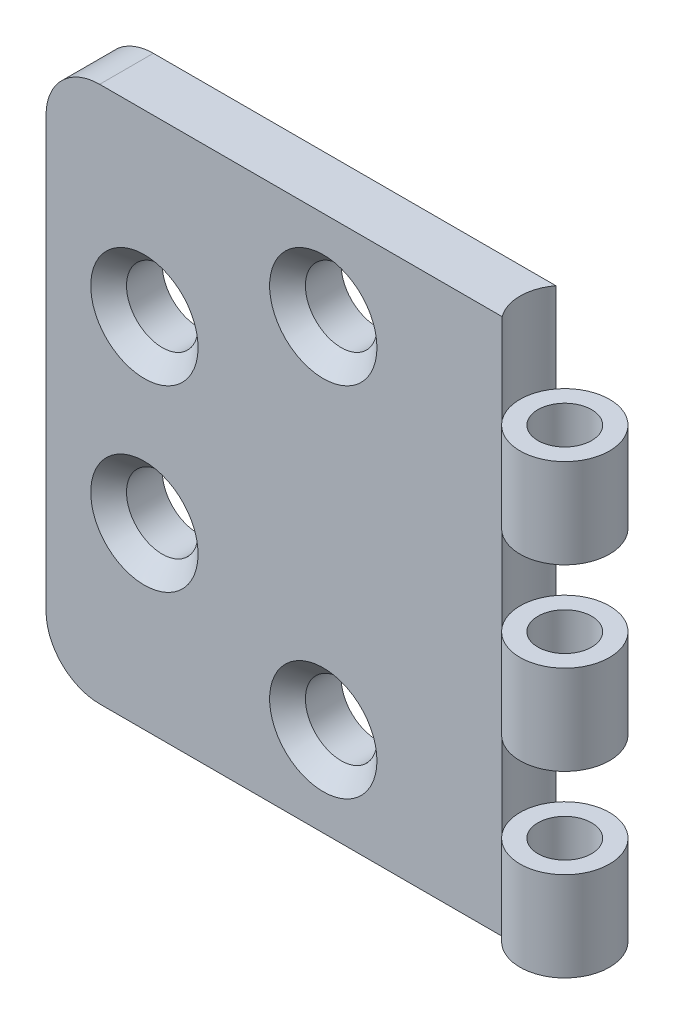
ISO-10303-21;
HEADER;
FILE_DESCRIPTION(('STEP AP214'),'2;1');
FILE_NAME('part.step','',(''),(''),'','','');
FILE_SCHEMA(('AUTOMOTIVE_DESIGN { 1 0 10303 214 1 1 1 1 }'));
ENDSEC;
DATA;
#1=APPLICATION_CONTEXT('core data for automotive mechanical design processes');
#2=APPLICATION_PROTOCOL_DEFINITION('international standard','automotive_design',2000,#1);
#3=PRODUCT_CONTEXT('',#1,'mechanical');
#4=PRODUCT('Part','Part','',(#3));
#5=PRODUCT_RELATED_PRODUCT_CATEGORY('part','',(#4));
#6=PRODUCT_DEFINITION_FORMATION('','',#4);
#7=PRODUCT_DEFINITION_CONTEXT('part definition',#1,'design');
#8=PRODUCT_DEFINITION('design','',#6,#7);
#9=PRODUCT_DEFINITION_SHAPE('','',#8);
#10=(LENGTH_UNIT() NAMED_UNIT(*) SI_UNIT(.MILLI.,.METRE.));
#11=(NAMED_UNIT(*) PLANE_ANGLE_UNIT() SI_UNIT($,.RADIAN.));
#12=(NAMED_UNIT(*) SI_UNIT($,.STERADIAN.) SOLID_ANGLE_UNIT());
#13=UNCERTAINTY_MEASURE_WITH_UNIT(LENGTH_MEASURE(1.E-05),#10,'distance_accuracy_value','');
#14=(GEOMETRIC_REPRESENTATION_CONTEXT(3) GLOBAL_UNCERTAINTY_ASSIGNED_CONTEXT((#13)) GLOBAL_UNIT_ASSIGNED_CONTEXT((#10,
#11,#12)) REPRESENTATION_CONTEXT('',''));
#15=CARTESIAN_POINT('',(0.,0.,0.));
#16=DIRECTION('',(0.,0.,1.));
#17=DIRECTION('',(1.,0.,0.));
#18=AXIS2_PLACEMENT_3D('',#15,#16,#17);
#19=CARTESIAN_POINT('',(12.5,15.,1.5));
#20=DIRECTION('',(0.,-1.,0.));
#21=DIRECTION('',(0.,0.,-1.));
#22=AXIS2_PLACEMENT_3D('',#19,#20,#21);
#23=CYLINDRICAL_SURFACE('',#22,2.5);
#24=DIRECTION('',(0.,-1.,0.));
#25=VECTOR('',#24,1.);
#26=CARTESIAN_POINT('',(10.5,22.0710678118655,0.));
#27=LINE('',#26,#25);
#28=CARTESIAN_POINT('',(10.5,10.,0.));
#29=VERTEX_POINT('',#28);
#30=CARTESIAN_POINT('',(10.5,5.,0.));
#31=VERTEX_POINT('',#30);
#32=EDGE_CURVE('E143',#29,#31,#27,.T.);
#33=ORIENTED_EDGE('',*,*,#32,.F.);
#34=CARTESIAN_POINT('',(12.5,10.,1.5));
#35=DIRECTION('',(0.,1.,0.));
#36=DIRECTION('',(0.,0.,1.));
#37=AXIS2_PLACEMENT_3D('',#34,#35,#36);
#38=CIRCLE('',#37,2.5);
#39=CARTESIAN_POINT('',(10.5,10.,3.));
#40=VERTEX_POINT('',#39);
#41=EDGE_CURVE('E154',#40,#29,#38,.T.);
#42=ORIENTED_EDGE('',*,*,#41,.F.);
#43=DIRECTION('',(0.,-1.,0.));
#44=VECTOR('',#43,1.);
#45=CARTESIAN_POINT('',(10.5,22.0710678118655,3.));
#46=LINE('',#45,#44);
#47=CARTESIAN_POINT('',(10.5,5.,3.));
#48=VERTEX_POINT('',#47);
#49=EDGE_CURVE('E278',#40,#48,#46,.T.);
#50=ORIENTED_EDGE('',*,*,#49,.T.);
#51=CARTESIAN_POINT('',(12.5,5.,1.5));
#52=DIRECTION('',(0.,-1.,0.));
#53=DIRECTION('',(0.,0.,-1.));
#54=AXIS2_PLACEMENT_3D('',#51,#52,#53);
#55=CIRCLE('',#54,2.5);
#56=EDGE_CURVE('E289',#31,#48,#55,.T.);
#57=ORIENTED_EDGE('',*,*,#56,.F.);
#58=EDGE_LOOP('',(#33,#42,#50,#57));
#59=FACE_BOUND('',#58,.T.);
#60=ADVANCED_FACE('F53',(#59),#23,.T.);
#61=CARTESIAN_POINT('',(12.5,0.,1.5));
#62=DIRECTION('',(0.,-1.,0.));
#63=DIRECTION('',(0.,0.,-1.));
#64=AXIS2_PLACEMENT_3D('',#61,#62,#63);
#65=CIRCLE('',#64,2.5);
#66=CARTESIAN_POINT('',(10.5,0.,0.));
#67=VERTEX_POINT('',#66);
#68=CARTESIAN_POINT('',(10.5,0.,3.));
#69=VERTEX_POINT('',#68);
#70=EDGE_CURVE('E290',#67,#69,#65,.T.);
#71=ORIENTED_EDGE('',*,*,#70,.T.);
#72=CARTESIAN_POINT('',(10.5,-5.,3.));
#73=VERTEX_POINT('',#72);
#74=EDGE_CURVE('E343',#69,#73,#46,.T.);
#75=ORIENTED_EDGE('',*,*,#74,.T.);
#76=CARTESIAN_POINT('',(12.5,-5.,1.5));
#77=DIRECTION('',(0.,-1.,0.));
#78=DIRECTION('',(0.,0.,-1.));
#79=AXIS2_PLACEMENT_3D('',#76,#77,#78);
#80=CIRCLE('',#79,2.5);
#81=CARTESIAN_POINT('',(10.5,-5.,0.));
#82=VERTEX_POINT('',#81);
#83=EDGE_CURVE('E207',#73,#82,#80,.F.);
#84=ORIENTED_EDGE('',*,*,#83,.T.);
#85=EDGE_CURVE('E355',#67,#82,#27,.T.);
#86=ORIENTED_EDGE('',*,*,#85,.F.);
#87=EDGE_LOOP('',(#71,#75,#84,#86));
#88=FACE_BOUND('',#87,.T.);
#89=ADVANCED_FACE('F315',(#88),#23,.T.);
#90=CARTESIAN_POINT('',(-15.,15.,3.));
#91=DIRECTION('',(0.,-1.,0.));
#92=DIRECTION('',(0.,0.,-1.));
#93=AXIS2_PLACEMENT_3D('',#90,#91,#92);
#94=PLANE('',#93);
#95=DIRECTION('',(-1.,0.,0.));
#96=VECTOR('',#95,1.);
#97=CARTESIAN_POINT('',(-15.,15.,3.));
#98=LINE('',#97,#96);
#99=CARTESIAN_POINT('',(10.5,15.,3.));
#100=VERTEX_POINT('',#99);
#101=CARTESIAN_POINT('',(-12.,15.,3.));
#102=VERTEX_POINT('',#101);
#103=EDGE_CURVE('E152',#100,#102,#98,.T.);
#104=ORIENTED_EDGE('',*,*,#103,.F.);
#105=CARTESIAN_POINT('',(12.5,15.,1.5));
#106=DIRECTION('',(0.,1.,0.));
#107=DIRECTION('',(0.,0.,1.));
#108=AXIS2_PLACEMENT_3D('',#105,#106,#107);
#109=CIRCLE('',#108,2.5);
#110=CARTESIAN_POINT('',(10.5,15.,0.));
#111=VERTEX_POINT('',#110);
#112=EDGE_CURVE('E138',#111,#100,#109,.T.);
#113=ORIENTED_EDGE('',*,*,#112,.F.);
#114=DIRECTION('',(-1.,0.,0.));
#115=VECTOR('',#114,1.);
#116=CARTESIAN_POINT('',(-15.,15.,0.));
#117=LINE('',#116,#115);
#118=CARTESIAN_POINT('',(-12.,15.,0.));
#119=VERTEX_POINT('',#118);
#120=EDGE_CURVE('E149',#111,#119,#117,.T.);
#121=ORIENTED_EDGE('',*,*,#120,.T.);
#122=DIRECTION('',(0.,0.,-1.));
#123=VECTOR('',#122,1.);
#124=CARTESIAN_POINT('',(-12.,15.,3.));
#125=LINE('',#124,#123);
#126=EDGE_CURVE('E182',#119,#102,#125,.F.);
#127=ORIENTED_EDGE('',*,*,#126,.T.);
#128=EDGE_LOOP('',(#104,#113,#121,#127));
#129=FACE_BOUND('',#128,.T.);
#130=ADVANCED_FACE('F148',(#129),#94,.F.);
#131=CARTESIAN_POINT('',(-15.,-15.,3.));
#132=DIRECTION('',(0.,1.,0.));
#133=DIRECTION('',(0.,0.,1.));
#134=AXIS2_PLACEMENT_3D('',#131,#132,#133);
#135=PLANE('',#134);
#136=CARTESIAN_POINT('',(12.5,-15.,1.5));
#137=DIRECTION('',(0.,-1.,0.));
#138=DIRECTION('',(0.,0.,-1.));
#139=AXIS2_PLACEMENT_3D('',#136,#137,#138);
#140=CIRCLE('',#139,1.5);
#141=CARTESIAN_POINT('',(12.5,-15.,0.));
#142=VERTEX_POINT('',#141);
#143=EDGE_CURVE('E215',#142,#142,#140,.T.);
#144=ORIENTED_EDGE('',*,*,#143,.F.);
#145=EDGE_LOOP('',(#144));
#146=FACE_BOUND('',#145,.T.);
#147=DIRECTION('',(1.,0.,0.));
#148=VECTOR('',#147,1.);
#149=CARTESIAN_POINT('',(-15.,-15.,3.));
#150=LINE('',#149,#148);
#151=CARTESIAN_POINT('',(-12.,-15.,3.));
#152=VERTEX_POINT('',#151);
#153=CARTESIAN_POINT('',(10.5,-15.,3.));
#154=VERTEX_POINT('',#153);
#155=EDGE_CURVE('E170',#152,#154,#150,.T.);
#156=ORIENTED_EDGE('',*,*,#155,.F.);
#157=DIRECTION('',(0.,0.,-1.));
#158=VECTOR('',#157,1.);
#159=CARTESIAN_POINT('',(-12.,-15.,3.));
#160=LINE('',#159,#158);
#161=CARTESIAN_POINT('',(-12.,-15.,0.));
#162=VERTEX_POINT('',#161);
#163=EDGE_CURVE('E188',#152,#162,#160,.T.);
#164=ORIENTED_EDGE('',*,*,#163,.T.);
#165=DIRECTION('',(1.,0.,0.));
#166=VECTOR('',#165,1.);
#167=CARTESIAN_POINT('',(-15.,-15.,0.));
#168=LINE('',#167,#166);
#169=CARTESIAN_POINT('',(10.5,-15.,0.));
#170=VERTEX_POINT('',#169);
#171=EDGE_CURVE('E164',#162,#170,#168,.T.);
#172=ORIENTED_EDGE('',*,*,#171,.T.);
#173=CARTESIAN_POINT('',(12.5,-15.,1.5));
#174=DIRECTION('',(0.,-1.,0.));
#175=DIRECTION('',(0.,0.,-1.));
#176=AXIS2_PLACEMENT_3D('',#173,#174,#175);
#177=CIRCLE('',#176,2.5);
#178=EDGE_CURVE('E161',#170,#154,#177,.T.);
#179=ORIENTED_EDGE('',*,*,#178,.T.);
#180=EDGE_LOOP('',(#156,#164,#172,#179));
#181=FACE_BOUND('',#180,.T.);
#182=ADVANCED_FACE('F247',(#146,#181),#135,.F.);
#183=CARTESIAN_POINT('',(0.,0.,3.));
#184=DIRECTION('',(0.,0.,1.));
#185=DIRECTION('',(1.,0.,0.));
#186=AXIS2_PLACEMENT_3D('',#183,#184,#185);
#187=PLANE('',#186);
#188=CARTESIAN_POINT('',(0.499999999999997,10.,3.));
#189=DIRECTION('',(0.,0.,1.));
#190=DIRECTION('',(1.,0.,0.));
#191=AXIS2_PLACEMENT_3D('',#188,#189,#190);
#192=CIRCLE('',#191,3.00000000000001);
#193=CARTESIAN_POINT('',(3.50000000000001,10.,3.));
#194=VERTEX_POINT('',#193);
#195=EDGE_CURVE('E227',#194,#194,#192,.F.);
#196=ORIENTED_EDGE('',*,*,#195,.T.);
#197=EDGE_LOOP('',(#196));
#198=FACE_BOUND('',#197,.T.);
#199=CARTESIAN_POINT('',(-9.50000000000001,5.,3.));
#200=DIRECTION('',(0.,0.,1.));
#201=DIRECTION('',(1.,0.,0.));
#202=AXIS2_PLACEMENT_3D('',#199,#200,#201);
#203=CIRCLE('',#202,2.99999999999999);
#204=CARTESIAN_POINT('',(-6.50000000000001,5.,3.));
#205=VERTEX_POINT('',#204);
#206=EDGE_CURVE('E224',#205,#205,#203,.F.);
#207=ORIENTED_EDGE('',*,*,#206,.T.);
#208=EDGE_LOOP('',(#207));
#209=FACE_BOUND('',#208,.T.);
#210=CARTESIAN_POINT('',(-9.5,-5.,3.));
#211=DIRECTION('',(0.,0.,1.));
#212=DIRECTION('',(1.,0.,0.));
#213=AXIS2_PLACEMENT_3D('',#210,#211,#212);
#214=CIRCLE('',#213,3.);
#215=CARTESIAN_POINT('',(-6.5,-5.,3.));
#216=VERTEX_POINT('',#215);
#217=EDGE_CURVE('E221',#216,#216,#214,.F.);
#218=ORIENTED_EDGE('',*,*,#217,.T.);
#219=EDGE_LOOP('',(#218));
#220=FACE_BOUND('',#219,.T.);
#221=CARTESIAN_POINT('',(0.5,-10.,3.));
#222=DIRECTION('',(0.,0.,1.));
#223=DIRECTION('',(1.,0.,0.));
#224=AXIS2_PLACEMENT_3D('',#221,#222,#223);
#225=CIRCLE('',#224,3.);
#226=CARTESIAN_POINT('',(3.5,-10.,3.));
#227=VERTEX_POINT('',#226);
#228=EDGE_CURVE('E218',#227,#227,#225,.F.);
#229=ORIENTED_EDGE('',*,*,#228,.T.);
#230=EDGE_LOOP('',(#229));
#231=FACE_BOUND('',#230,.T.);
#232=ORIENTED_EDGE('',*,*,#103,.T.);
#233=CARTESIAN_POINT('',(-12.,12.,3.));
#234=DIRECTION('',(0.,0.,1.));
#235=DIRECTION('',(1.,0.,0.));
#236=AXIS2_PLACEMENT_3D('',#233,#234,#235);
#237=CIRCLE('',#236,3.);
#238=CARTESIAN_POINT('',(-15.,12.,3.));
#239=VERTEX_POINT('',#238);
#240=EDGE_CURVE('E186',#102,#239,#237,.T.);
#241=ORIENTED_EDGE('',*,*,#240,.T.);
#242=DIRECTION('',(0.,-1.,0.));
#243=VECTOR('',#242,1.);
#244=CARTESIAN_POINT('',(-15.,15.,3.));
#245=LINE('',#244,#243);
#246=CARTESIAN_POINT('',(-15.,-12.,3.));
#247=VERTEX_POINT('',#246);
#248=EDGE_CURVE('E256',#239,#247,#245,.T.);
#249=ORIENTED_EDGE('',*,*,#248,.T.);
#250=CARTESIAN_POINT('',(-12.,-12.,3.));
#251=DIRECTION('',(0.,0.,1.));
#252=DIRECTION('',(1.,0.,0.));
#253=AXIS2_PLACEMENT_3D('',#250,#251,#252);
#254=CIRCLE('',#253,3.);
#255=EDGE_CURVE('E184',#247,#152,#254,.T.);
#256=ORIENTED_EDGE('',*,*,#255,.T.);
#257=ORIENTED_EDGE('',*,*,#155,.T.);
#258=CARTESIAN_POINT('',(10.5,-9.99999999999999,3.));
#259=VERTEX_POINT('',#258);
#260=EDGE_CURVE('E195',#259,#154,#46,.T.);
#261=ORIENTED_EDGE('',*,*,#260,.F.);
#262=EDGE_CURVE('E279',#73,#259,#46,.T.);
#263=ORIENTED_EDGE('',*,*,#262,.F.);
#264=ORIENTED_EDGE('',*,*,#74,.F.);
#265=DIRECTION('',(0.,-1.,0.));
#266=VECTOR('',#265,1.);
#267=CARTESIAN_POINT('',(10.5,5.,3.));
#268=LINE('',#267,#266);
#269=EDGE_CURVE('E283',#48,#69,#268,.T.);
#270=ORIENTED_EDGE('',*,*,#269,.F.);
#271=ORIENTED_EDGE('',*,*,#49,.F.);
#272=EDGE_CURVE('E167',#100,#40,#46,.T.);
#273=ORIENTED_EDGE('',*,*,#272,.F.);
#274=EDGE_LOOP('',(#232,#241,#249,#256,#257,#261,#263,#264,#270,#271,#273));
#275=FACE_BOUND('',#274,.T.);
#276=ADVANCED_FACE('F244',(#198,#209,#220,#231,#275),#187,.T.);
#277=CARTESIAN_POINT('',(0.,0.,0.));
#278=DIRECTION('',(0.,0.,1.));
#279=DIRECTION('',(1.,0.,0.));
#280=AXIS2_PLACEMENT_3D('',#277,#278,#279);
#281=PLANE('',#280);
#282=CARTESIAN_POINT('',(0.499999999999997,10.,0.));
#283=DIRECTION('',(0.,0.,1.));
#284=DIRECTION('',(1.,0.,0.));
#285=AXIS2_PLACEMENT_3D('',#282,#283,#284);
#286=CIRCLE('',#285,2.);
#287=CARTESIAN_POINT('',(2.5,10.,0.));
#288=VERTEX_POINT('',#287);
#289=EDGE_CURVE('E202',#288,#288,#286,.T.);
#290=ORIENTED_EDGE('',*,*,#289,.T.);
#291=EDGE_LOOP('',(#290));
#292=FACE_BOUND('',#291,.T.);
#293=CARTESIAN_POINT('',(-9.50000000000001,5.,0.));
#294=DIRECTION('',(0.,0.,1.));
#295=DIRECTION('',(1.,0.,0.));
#296=AXIS2_PLACEMENT_3D('',#293,#294,#295);
#297=CIRCLE('',#296,2.);
#298=CARTESIAN_POINT('',(-7.50000000000001,5.,0.));
#299=VERTEX_POINT('',#298);
#300=EDGE_CURVE('E199',#299,#299,#297,.T.);
#301=ORIENTED_EDGE('',*,*,#300,.T.);
#302=EDGE_LOOP('',(#301));
#303=FACE_BOUND('',#302,.T.);
#304=CARTESIAN_POINT('',(0.5,-10.,0.));
#305=DIRECTION('',(0.,0.,1.));
#306=DIRECTION('',(1.,0.,0.));
#307=AXIS2_PLACEMENT_3D('',#304,#305,#306);
#308=CIRCLE('',#307,2.);
#309=CARTESIAN_POINT('',(2.5,-10.,0.));
#310=VERTEX_POINT('',#309);
#311=EDGE_CURVE('E196',#310,#310,#308,.F.);
#312=ORIENTED_EDGE('',*,*,#311,.F.);
#313=EDGE_LOOP('',(#312));
#314=FACE_BOUND('',#313,.T.);
#315=CARTESIAN_POINT('',(-9.5,-5.,0.));
#316=DIRECTION('',(0.,0.,1.));
#317=DIRECTION('',(1.,0.,0.));
#318=AXIS2_PLACEMENT_3D('',#315,#316,#317);
#319=CIRCLE('',#318,2.);
#320=CARTESIAN_POINT('',(-7.5,-5.,0.));
#321=VERTEX_POINT('',#320);
#322=EDGE_CURVE('E192',#321,#321,#319,.F.);
#323=ORIENTED_EDGE('',*,*,#322,.F.);
#324=EDGE_LOOP('',(#323));
#325=FACE_BOUND('',#324,.T.);
#326=DIRECTION('',(0.,-1.,0.));
#327=VECTOR('',#326,1.);
#328=CARTESIAN_POINT('',(-15.,15.,0.));
#329=LINE('',#328,#327);
#330=CARTESIAN_POINT('',(-15.,12.,0.));
#331=VERTEX_POINT('',#330);
#332=CARTESIAN_POINT('',(-15.,-12.,0.));
#333=VERTEX_POINT('',#332);
#334=EDGE_CURVE('E160',#331,#333,#329,.T.);
#335=ORIENTED_EDGE('',*,*,#334,.F.);
#336=CARTESIAN_POINT('',(-12.,12.,0.));
#337=DIRECTION('',(0.,0.,1.));
#338=DIRECTION('',(1.,0.,0.));
#339=AXIS2_PLACEMENT_3D('',#336,#337,#338);
#340=CIRCLE('',#339,3.);
#341=EDGE_CURVE('E159',#331,#119,#340,.F.);
#342=ORIENTED_EDGE('',*,*,#341,.T.);
#343=ORIENTED_EDGE('',*,*,#120,.F.);
#344=EDGE_CURVE('E135',#111,#29,#27,.T.);
#345=ORIENTED_EDGE('',*,*,#344,.T.);
#346=ORIENTED_EDGE('',*,*,#32,.T.);
#347=EDGE_CURVE('E275',#31,#67,#27,.T.);
#348=ORIENTED_EDGE('',*,*,#347,.T.);
#349=ORIENTED_EDGE('',*,*,#85,.T.);
#350=CARTESIAN_POINT('',(10.5,-10.,0.));
#351=VERTEX_POINT('',#350);
#352=EDGE_CURVE('E145',#82,#351,#27,.T.);
#353=ORIENTED_EDGE('',*,*,#352,.T.);
#354=EDGE_CURVE('E274',#351,#170,#27,.T.);
#355=ORIENTED_EDGE('',*,*,#354,.T.);
#356=ORIENTED_EDGE('',*,*,#171,.F.);
#357=CARTESIAN_POINT('',(-12.,-12.,0.));
#358=DIRECTION('',(0.,0.,1.));
#359=DIRECTION('',(1.,0.,0.));
#360=AXIS2_PLACEMENT_3D('',#357,#358,#359);
#361=CIRCLE('',#360,3.);
#362=EDGE_CURVE('E179',#162,#333,#361,.F.);
#363=ORIENTED_EDGE('',*,*,#362,.T.);
#364=EDGE_LOOP('',(#335,#342,#343,#345,#346,#348,#349,#353,#355,#356,#363));
#365=FACE_BOUND('',#364,.T.);
#366=ADVANCED_FACE('F158',(#292,#303,#314,#325,#365),#281,.F.);
#367=CARTESIAN_POINT('',(-15.,15.,3.));
#368=DIRECTION('',(1.,0.,0.));
#369=DIRECTION('',(0.,1.,0.));
#370=AXIS2_PLACEMENT_3D('',#367,#368,#369);
#371=PLANE('',#370);
#372=ORIENTED_EDGE('',*,*,#248,.F.);
#373=DIRECTION('',(0.,0.,-1.));
#374=VECTOR('',#373,1.);
#375=CARTESIAN_POINT('',(-15.,12.,3.));
#376=LINE('',#375,#374);
#377=EDGE_CURVE('E176',#239,#331,#376,.T.);
#378=ORIENTED_EDGE('',*,*,#377,.T.);
#379=ORIENTED_EDGE('',*,*,#334,.T.);
#380=DIRECTION('',(0.,0.,-1.));
#381=VECTOR('',#380,1.);
#382=CARTESIAN_POINT('',(-15.,-12.,3.));
#383=LINE('',#382,#381);
#384=EDGE_CURVE('E142',#333,#247,#383,.F.);
#385=ORIENTED_EDGE('',*,*,#384,.T.);
#386=EDGE_LOOP('',(#372,#378,#379,#385));
#387=FACE_BOUND('',#386,.T.);
#388=ADVANCED_FACE('F262',(#387),#371,.F.);
#389=CARTESIAN_POINT('',(12.5,-10.,1.5));
#390=DIRECTION('',(0.,-1.,0.));
#391=DIRECTION('',(0.,0.,-1.));
#392=AXIS2_PLACEMENT_3D('',#389,#390,#391);
#393=CIRCLE('',#392,2.5);
#394=EDGE_CURVE('E191',#259,#351,#393,.F.);
#395=ORIENTED_EDGE('',*,*,#394,.F.);
#396=ORIENTED_EDGE('',*,*,#260,.T.);
#397=ORIENTED_EDGE('',*,*,#178,.F.);
#398=ORIENTED_EDGE('',*,*,#354,.F.);
#399=EDGE_LOOP('',(#395,#396,#397,#398));
#400=FACE_BOUND('',#399,.T.);
#401=ADVANCED_FACE('F322',(#400),#23,.T.);
#402=CARTESIAN_POINT('',(-12.,12.,3.));
#403=DIRECTION('',(0.,0.,-1.));
#404=DIRECTION('',(-1.,0.,0.));
#405=AXIS2_PLACEMENT_3D('',#402,#403,#404);
#406=CYLINDRICAL_SURFACE('',#405,3.);
#407=ORIENTED_EDGE('',*,*,#240,.F.);
#408=ORIENTED_EDGE('',*,*,#126,.F.);
#409=ORIENTED_EDGE('',*,*,#341,.F.);
#410=ORIENTED_EDGE('',*,*,#377,.F.);
#411=EDGE_LOOP('',(#407,#408,#409,#410));
#412=FACE_BOUND('',#411,.T.);
#413=ADVANCED_FACE('F260',(#412),#406,.T.);
#414=CARTESIAN_POINT('',(-12.,-12.,3.));
#415=DIRECTION('',(0.,0.,-1.));
#416=DIRECTION('',(-1.,0.,0.));
#417=AXIS2_PLACEMENT_3D('',#414,#415,#416);
#418=CYLINDRICAL_SURFACE('',#417,3.);
#419=ORIENTED_EDGE('',*,*,#255,.F.);
#420=ORIENTED_EDGE('',*,*,#384,.F.);
#421=ORIENTED_EDGE('',*,*,#362,.F.);
#422=ORIENTED_EDGE('',*,*,#163,.F.);
#423=EDGE_LOOP('',(#419,#420,#421,#422));
#424=FACE_BOUND('',#423,.T.);
#425=ADVANCED_FACE('F268',(#424),#418,.T.);
#426=CARTESIAN_POINT('',(-9.5,-5.,-1.));
#427=DIRECTION('',(0.,0.,1.));
#428=DIRECTION('',(1.,0.,0.));
#429=AXIS2_PLACEMENT_3D('',#426,#427,#428);
#430=CYLINDRICAL_SURFACE('',#429,2.);
#431=CARTESIAN_POINT('',(-9.5,-5.,1.99999999999999));
#432=DIRECTION('',(0.,0.,1.));
#433=DIRECTION('',(1.,0.,0.));
#434=AXIS2_PLACEMENT_3D('',#431,#432,#433);
#435=CIRCLE('',#434,2.);
#436=CARTESIAN_POINT('',(-7.5,-5.,1.99999999999999));
#437=VERTEX_POINT('',#436);
#438=EDGE_CURVE('E61',#437,#437,#435,.T.);
#439=ORIENTED_EDGE('',*,*,#438,.T.);
#440=EDGE_LOOP('',(#439));
#441=FACE_BOUND('',#440,.T.);
#442=ORIENTED_EDGE('',*,*,#322,.T.);
#443=EDGE_LOOP('',(#442));
#444=FACE_BOUND('',#443,.T.);
#445=ADVANCED_FACE('F235',(#441,#444),#430,.F.);
#446=CARTESIAN_POINT('',(0.5,-10.,-1.));
#447=DIRECTION('',(0.,0.,1.));
#448=DIRECTION('',(1.,0.,0.));
#449=AXIS2_PLACEMENT_3D('',#446,#447,#448);
#450=CYLINDRICAL_SURFACE('',#449,2.);
#451=CARTESIAN_POINT('',(0.5,-10.,1.99999999999999));
#452=DIRECTION('',(0.,0.,1.));
#453=DIRECTION('',(1.,0.,0.));
#454=AXIS2_PLACEMENT_3D('',#451,#452,#453);
#455=CIRCLE('',#454,2.);
#456=CARTESIAN_POINT('',(2.5,-10.,1.99999999999999));
#457=VERTEX_POINT('',#456);
#458=EDGE_CURVE('E12',#457,#457,#455,.T.);
#459=ORIENTED_EDGE('',*,*,#458,.T.);
#460=EDGE_LOOP('',(#459));
#461=FACE_BOUND('',#460,.T.);
#462=ORIENTED_EDGE('',*,*,#311,.T.);
#463=EDGE_LOOP('',(#462));
#464=FACE_BOUND('',#463,.T.);
#465=ADVANCED_FACE('F395',(#461,#464),#450,.F.);
#466=CARTESIAN_POINT('',(-9.50000000000001,5.,-1.));
#467=DIRECTION('',(0.,0.,1.));
#468=DIRECTION('',(1.,0.,0.));
#469=AXIS2_PLACEMENT_3D('',#466,#467,#468);
#470=CYLINDRICAL_SURFACE('',#469,2.);
#471=CARTESIAN_POINT('',(-9.50000000000001,5.,2.00000000000002));
#472=DIRECTION('',(0.,0.,1.));
#473=DIRECTION('',(1.,0.,0.));
#474=AXIS2_PLACEMENT_3D('',#471,#472,#473);
#475=CIRCLE('',#474,2.);
#476=CARTESIAN_POINT('',(-7.50000000000001,5.,2.00000000000002));
#477=VERTEX_POINT('',#476);
#478=EDGE_CURVE('E230',#477,#477,#475,.T.);
#479=ORIENTED_EDGE('',*,*,#478,.T.);
#480=EDGE_LOOP('',(#479));
#481=FACE_BOUND('',#480,.T.);
#482=ORIENTED_EDGE('',*,*,#300,.F.);
#483=EDGE_LOOP('',(#482));
#484=FACE_BOUND('',#483,.T.);
#485=ADVANCED_FACE('F391',(#481,#484),#470,.F.);
#486=CARTESIAN_POINT('',(0.499999999999997,10.,-1.));
#487=DIRECTION('',(0.,0.,1.));
#488=DIRECTION('',(1.,0.,0.));
#489=AXIS2_PLACEMENT_3D('',#486,#487,#488);
#490=CYLINDRICAL_SURFACE('',#489,2.);
#491=CARTESIAN_POINT('',(0.499999999999997,10.,1.99999999999999));
#492=DIRECTION('',(0.,0.,1.));
#493=DIRECTION('',(1.,0.,0.));
#494=AXIS2_PLACEMENT_3D('',#491,#492,#493);
#495=CIRCLE('',#494,2.);
#496=CARTESIAN_POINT('',(2.5,10.,1.99999999999999));
#497=VERTEX_POINT('',#496);
#498=EDGE_CURVE('E210',#497,#497,#495,.T.);
#499=ORIENTED_EDGE('',*,*,#498,.T.);
#500=EDGE_LOOP('',(#499));
#501=FACE_BOUND('',#500,.T.);
#502=ORIENTED_EDGE('',*,*,#289,.F.);
#503=EDGE_LOOP('',(#502));
#504=FACE_BOUND('',#503,.T.);
#505=ADVANCED_FACE('F388',(#501,#504),#490,.F.);
#506=CARTESIAN_POINT('',(12.5,-5.,1.5));
#507=DIRECTION('',(0.,-1.,0.));
#508=DIRECTION('',(0.,0.,-1.));
#509=AXIS2_PLACEMENT_3D('',#506,#507,#508);
#510=CYLINDRICAL_SURFACE('',#509,2.5);
#511=ORIENTED_EDGE('',*,*,#262,.T.);
#512=CARTESIAN_POINT('',(12.5,-10.,1.5));
#513=DIRECTION('',(0.,-1.,0.));
#514=DIRECTION('',(0.,0.,-1.));
#515=AXIS2_PLACEMENT_3D('',#512,#513,#514);
#516=CIRCLE('',#515,2.5);
#517=EDGE_CURVE('E280',#259,#351,#516,.T.);
#518=ORIENTED_EDGE('',*,*,#517,.T.);
#519=ORIENTED_EDGE('',*,*,#352,.F.);
#520=CARTESIAN_POINT('',(12.5,-5.,1.5));
#521=DIRECTION('',(0.,-1.,0.));
#522=DIRECTION('',(0.,0.,-1.));
#523=AXIS2_PLACEMENT_3D('',#520,#521,#522);
#524=CIRCLE('',#523,2.5);
#525=EDGE_CURVE('E205',#73,#82,#524,.T.);
#526=ORIENTED_EDGE('',*,*,#525,.F.);
#527=EDGE_LOOP('',(#511,#518,#519,#526));
#528=FACE_BOUND('',#527,.T.);
#529=ADVANCED_FACE('F360',(#528),#510,.F.);
#530=CARTESIAN_POINT('',(12.5,-5.,1.5));
#531=DIRECTION('',(0.,-1.,0.));
#532=DIRECTION('',(0.,0.,-1.));
#533=AXIS2_PLACEMENT_3D('',#530,#531,#532);
#534=PLANE('',#533);
#535=CARTESIAN_POINT('',(12.5,-5.,1.5));
#536=DIRECTION('',(0.,-1.,0.));
#537=DIRECTION('',(0.,0.,-1.));
#538=AXIS2_PLACEMENT_3D('',#535,#536,#537);
#539=CIRCLE('',#538,1.5);
#540=CARTESIAN_POINT('',(12.5,-5.,0.));
#541=VERTEX_POINT('',#540);
#542=EDGE_CURVE('E155',#541,#541,#539,.T.);
#543=ORIENTED_EDGE('',*,*,#542,.F.);
#544=EDGE_LOOP('',(#543));
#545=FACE_BOUND('',#544,.T.);
#546=ORIENTED_EDGE('',*,*,#525,.T.);
#547=ORIENTED_EDGE('',*,*,#83,.F.);
#548=EDGE_LOOP('',(#546,#547));
#549=FACE_BOUND('',#548,.T.);
#550=ADVANCED_FACE('F362',(#545,#549),#534,.T.);
#551=CARTESIAN_POINT('',(12.5,-10.,1.5));
#552=DIRECTION('',(0.,-1.,0.));
#553=DIRECTION('',(0.,0.,-1.));
#554=AXIS2_PLACEMENT_3D('',#551,#552,#553);
#555=PLANE('',#554);
#556=CARTESIAN_POINT('',(12.5,-10.,1.5));
#557=DIRECTION('',(0.,-1.,0.));
#558=DIRECTION('',(0.,0.,-1.));
#559=AXIS2_PLACEMENT_3D('',#556,#557,#558);
#560=CIRCLE('',#559,1.5);
#561=CARTESIAN_POINT('',(12.5,-10.,0.));
#562=VERTEX_POINT('',#561);
#563=EDGE_CURVE('E296',#562,#562,#560,.T.);
#564=ORIENTED_EDGE('',*,*,#563,.T.);
#565=EDGE_LOOP('',(#564));
#566=FACE_BOUND('',#565,.T.);
#567=ORIENTED_EDGE('',*,*,#517,.F.);
#568=ORIENTED_EDGE('',*,*,#394,.T.);
#569=EDGE_LOOP('',(#567,#568));
#570=FACE_BOUND('',#569,.T.);
#571=ADVANCED_FACE('F379',(#566,#570),#555,.F.);
#572=CARTESIAN_POINT('',(12.5,5.,1.5));
#573=DIRECTION('',(0.,-1.,0.));
#574=DIRECTION('',(0.,0.,-1.));
#575=AXIS2_PLACEMENT_3D('',#572,#573,#574);
#576=CYLINDRICAL_SURFACE('',#575,2.5);
#577=ORIENTED_EDGE('',*,*,#269,.T.);
#578=EDGE_CURVE('E76',#69,#67,#65,.T.);
#579=ORIENTED_EDGE('',*,*,#578,.T.);
#580=ORIENTED_EDGE('',*,*,#347,.F.);
#581=EDGE_CURVE('E287',#48,#31,#55,.T.);
#582=ORIENTED_EDGE('',*,*,#581,.F.);
#583=EDGE_LOOP('',(#577,#579,#580,#582));
#584=FACE_BOUND('',#583,.T.);
#585=ADVANCED_FACE('F353',(#584),#576,.F.);
#586=CARTESIAN_POINT('',(12.5,5.,1.5));
#587=DIRECTION('',(0.,-1.,0.));
#588=DIRECTION('',(0.,0.,-1.));
#589=AXIS2_PLACEMENT_3D('',#586,#587,#588);
#590=PLANE('',#589);
#591=CARTESIAN_POINT('',(12.5,5.,1.5));
#592=DIRECTION('',(0.,-1.,0.));
#593=DIRECTION('',(0.,0.,-1.));
#594=AXIS2_PLACEMENT_3D('',#591,#592,#593);
#595=CIRCLE('',#594,1.5);
#596=CARTESIAN_POINT('',(12.5,5.,0.));
#597=VERTEX_POINT('',#596);
#598=EDGE_CURVE('E299',#597,#597,#595,.T.);
#599=ORIENTED_EDGE('',*,*,#598,.F.);
#600=EDGE_LOOP('',(#599));
#601=FACE_BOUND('',#600,.T.);
#602=ORIENTED_EDGE('',*,*,#581,.T.);
#603=ORIENTED_EDGE('',*,*,#56,.T.);
#604=EDGE_LOOP('',(#602,#603));
#605=FACE_BOUND('',#604,.T.);
#606=ADVANCED_FACE('F352',(#601,#605),#590,.T.);
#607=CARTESIAN_POINT('',(12.5,0.,1.5));
#608=DIRECTION('',(0.,-1.,0.));
#609=DIRECTION('',(0.,0.,-1.));
#610=AXIS2_PLACEMENT_3D('',#607,#608,#609);
#611=PLANE('',#610);
#612=CARTESIAN_POINT('',(12.5,0.,1.5));
#613=DIRECTION('',(0.,-1.,0.));
#614=DIRECTION('',(0.,0.,-1.));
#615=AXIS2_PLACEMENT_3D('',#612,#613,#614);
#616=CIRCLE('',#615,1.5);
#617=CARTESIAN_POINT('',(12.5,0.,0.));
#618=VERTEX_POINT('',#617);
#619=EDGE_CURVE('E214',#618,#618,#616,.T.);
#620=ORIENTED_EDGE('',*,*,#619,.T.);
#621=EDGE_LOOP('',(#620));
#622=FACE_BOUND('',#621,.T.);
#623=ORIENTED_EDGE('',*,*,#578,.F.);
#624=ORIENTED_EDGE('',*,*,#70,.F.);
#625=EDGE_LOOP('',(#623,#624));
#626=FACE_BOUND('',#625,.T.);
#627=ADVANCED_FACE('F364',(#622,#626),#611,.F.);
#628=CARTESIAN_POINT('',(12.5,10.,1.5));
#629=DIRECTION('',(0.,1.,0.));
#630=DIRECTION('',(0.,0.,1.));
#631=AXIS2_PLACEMENT_3D('',#628,#629,#630);
#632=CYLINDRICAL_SURFACE('',#631,2.5);
#633=ORIENTED_EDGE('',*,*,#272,.T.);
#634=EDGE_CURVE('E68',#29,#40,#38,.T.);
#635=ORIENTED_EDGE('',*,*,#634,.F.);
#636=ORIENTED_EDGE('',*,*,#344,.F.);
#637=ORIENTED_EDGE('',*,*,#112,.T.);
#638=EDGE_LOOP('',(#633,#635,#636,#637));
#639=FACE_BOUND('',#638,.T.);
#640=ADVANCED_FACE('F137',(#639),#632,.F.);
#641=CARTESIAN_POINT('',(12.5,10.,1.5));
#642=DIRECTION('',(0.,1.,0.));
#643=DIRECTION('',(0.,0.,1.));
#644=AXIS2_PLACEMENT_3D('',#641,#642,#643);
#645=PLANE('',#644);
#646=CARTESIAN_POINT('',(12.5,10.,1.5));
#647=DIRECTION('',(0.,1.,0.));
#648=DIRECTION('',(0.,0.,1.));
#649=AXIS2_PLACEMENT_3D('',#646,#647,#648);
#650=CIRCLE('',#649,1.5);
#651=CARTESIAN_POINT('',(12.5,10.,3.));
#652=VERTEX_POINT('',#651);
#653=EDGE_CURVE('E211',#652,#652,#650,.T.);
#654=ORIENTED_EDGE('',*,*,#653,.F.);
#655=EDGE_LOOP('',(#654));
#656=FACE_BOUND('',#655,.T.);
#657=ORIENTED_EDGE('',*,*,#634,.T.);
#658=ORIENTED_EDGE('',*,*,#41,.T.);
#659=EDGE_LOOP('',(#657,#658));
#660=FACE_BOUND('',#659,.T.);
#661=ADVANCED_FACE('F372',(#656,#660),#645,.T.);
#662=CARTESIAN_POINT('',(12.5,15.,1.5));
#663=DIRECTION('',(0.,-1.,0.));
#664=DIRECTION('',(0.,0.,-1.));
#665=AXIS2_PLACEMENT_3D('',#662,#663,#664);
#666=CYLINDRICAL_SURFACE('',#665,1.5);
#667=ORIENTED_EDGE('',*,*,#598,.T.);
#668=EDGE_LOOP('',(#667));
#669=FACE_BOUND('',#668,.T.);
#670=ORIENTED_EDGE('',*,*,#653,.T.);
#671=EDGE_LOOP('',(#670));
#672=FACE_BOUND('',#671,.T.);
#673=ADVANCED_FACE('F533',(#669,#672),#666,.F.);
#674=ORIENTED_EDGE('',*,*,#542,.T.);
#675=EDGE_LOOP('',(#674));
#676=FACE_BOUND('',#675,.T.);
#677=ORIENTED_EDGE('',*,*,#619,.F.);
#678=EDGE_LOOP('',(#677));
#679=FACE_BOUND('',#678,.T.);
#680=ADVANCED_FACE('F543',(#676,#679),#666,.F.);
#681=ORIENTED_EDGE('',*,*,#143,.T.);
#682=EDGE_LOOP('',(#681));
#683=FACE_BOUND('',#682,.T.);
#684=ORIENTED_EDGE('',*,*,#563,.F.);
#685=EDGE_LOOP('',(#684));
#686=FACE_BOUND('',#685,.T.);
#687=ADVANCED_FACE('F307',(#683,#686),#666,.F.);
#688=CARTESIAN_POINT('',(0.499999999999997,10.,1.99999999999999));
#689=DIRECTION('',(0.,0.,1.));
#690=DIRECTION('',(1.,0.,0.));
#691=AXIS2_PLACEMENT_3D('',#688,#689,#690);
#692=CONICAL_SURFACE('',#691,2.,0.785398163397452);
#693=ORIENTED_EDGE('',*,*,#195,.F.);
#694=EDGE_LOOP('',(#693));
#695=FACE_BOUND('',#694,.T.);
#696=ORIENTED_EDGE('',*,*,#498,.F.);
#697=EDGE_LOOP('',(#696));
#698=FACE_BOUND('',#697,.T.);
#699=ADVANCED_FACE('F407',(#695,#698),#692,.F.);
#700=CARTESIAN_POINT('',(-9.50000000000001,5.,2.00000000000002));
#701=DIRECTION('',(0.,0.,1.));
#702=DIRECTION('',(1.,0.,0.));
#703=AXIS2_PLACEMENT_3D('',#700,#701,#702);
#704=CONICAL_SURFACE('',#703,2.,0.785398163397452);
#705=ORIENTED_EDGE('',*,*,#206,.F.);
#706=EDGE_LOOP('',(#705));
#707=FACE_BOUND('',#706,.T.);
#708=ORIENTED_EDGE('',*,*,#478,.F.);
#709=EDGE_LOOP('',(#708));
#710=FACE_BOUND('',#709,.T.);
#711=ADVANCED_FACE('F241',(#707,#710),#704,.F.);
#712=CARTESIAN_POINT('',(-9.5,-5.,3.));
#713=DIRECTION('',(0.,0.,1.));
#714=DIRECTION('',(1.,0.,0.));
#715=AXIS2_PLACEMENT_3D('',#712,#713,#714);
#716=CONICAL_SURFACE('',#715,3.,0.785398163397447);
#717=ORIENTED_EDGE('',*,*,#438,.F.);
#718=EDGE_LOOP('',(#717));
#719=FACE_BOUND('',#718,.T.);
#720=ORIENTED_EDGE('',*,*,#217,.F.);
#721=EDGE_LOOP('',(#720));
#722=FACE_BOUND('',#721,.T.);
#723=ADVANCED_FACE('F238',(#719,#722),#716,.F.);
#724=CARTESIAN_POINT('',(0.5,-10.,3.));
#725=DIRECTION('',(0.,0.,1.));
#726=DIRECTION('',(1.,0.,0.));
#727=AXIS2_PLACEMENT_3D('',#724,#725,#726);
#728=CONICAL_SURFACE('',#727,3.,0.785398163397447);
#729=ORIENTED_EDGE('',*,*,#458,.F.);
#730=EDGE_LOOP('',(#729));
#731=FACE_BOUND('',#730,.T.);
#732=ORIENTED_EDGE('',*,*,#228,.F.);
#733=EDGE_LOOP('',(#732));
#734=FACE_BOUND('',#733,.T.);
#735=ADVANCED_FACE('F55',(#731,#734),#728,.F.);
#736=CLOSED_SHELL('',(#60,#89,#130,#182,#276,#366,#388,#401,#413,#425,#445,#465,#485,#505,#529,
#550,#571,#585,#606,#627,#640,#661,#673,#680,#687,#699,#711,#723,#735));
#737=MANIFOLD_SOLID_BREP('B2',#736);
#738=ADVANCED_BREP_SHAPE_REPRESENTATION('',(#18,#737),#14);
#739=SHAPE_DEFINITION_REPRESENTATION(#9,#738);
ENDSEC;
END-ISO-10303-21;
